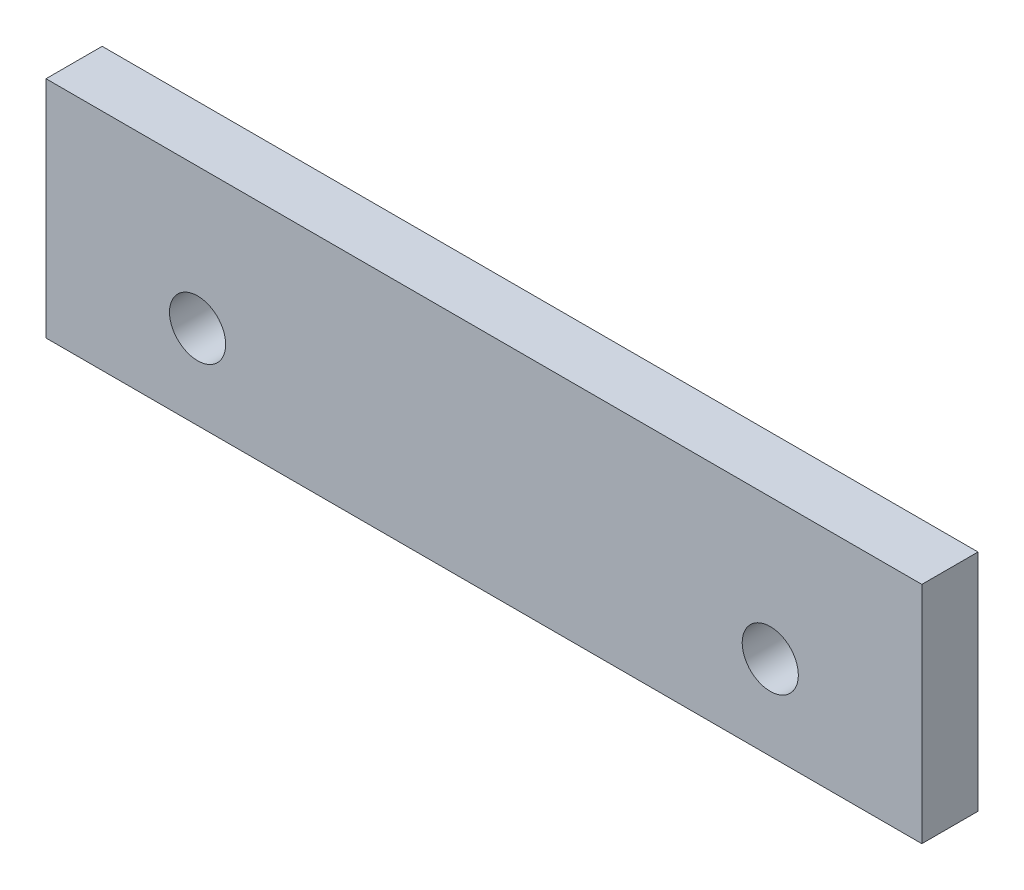
ISO-10303-21;
HEADER;
FILE_DESCRIPTION(('STEP AP214'),'2;1');
FILE_NAME('part.step','',(''),(''),'','','');
FILE_SCHEMA(('AUTOMOTIVE_DESIGN { 1 0 10303 214 1 1 1 1 }'));
ENDSEC;
DATA;
#1=APPLICATION_CONTEXT('core data for automotive mechanical design processes');
#2=APPLICATION_PROTOCOL_DEFINITION('international standard','automotive_design',2000,#1);
#3=PRODUCT_CONTEXT('',#1,'mechanical');
#4=PRODUCT('Part','Part','',(#3));
#5=PRODUCT_RELATED_PRODUCT_CATEGORY('part','',(#4));
#6=PRODUCT_DEFINITION_FORMATION('','',#4);
#7=PRODUCT_DEFINITION_CONTEXT('part definition',#1,'design');
#8=PRODUCT_DEFINITION('design','',#6,#7);
#9=PRODUCT_DEFINITION_SHAPE('','',#8);
#10=(LENGTH_UNIT() NAMED_UNIT(*) SI_UNIT(.MILLI.,.METRE.));
#11=(NAMED_UNIT(*) PLANE_ANGLE_UNIT() SI_UNIT($,.RADIAN.));
#12=(NAMED_UNIT(*) SI_UNIT($,.STERADIAN.) SOLID_ANGLE_UNIT());
#13=UNCERTAINTY_MEASURE_WITH_UNIT(LENGTH_MEASURE(1.E-05),#10,'distance_accuracy_value','');
#14=(GEOMETRIC_REPRESENTATION_CONTEXT(3) GLOBAL_UNCERTAINTY_ASSIGNED_CONTEXT((#13)) GLOBAL_UNIT_ASSIGNED_CONTEXT((#10,
#11,#12)) REPRESENTATION_CONTEXT('',''));
#15=CARTESIAN_POINT('',(0.,0.,0.));
#16=DIRECTION('',(0.,0.,1.));
#17=DIRECTION('',(1.,0.,0.));
#18=AXIS2_PLACEMENT_3D('',#15,#16,#17);
#19=CARTESIAN_POINT('',(-39.,10.,5.));
#20=DIRECTION('',(1.,0.,0.));
#21=DIRECTION('',(0.,0.,-1.));
#22=AXIS2_PLACEMENT_3D('',#19,#20,#21);
#23=PLANE('',#22);
#24=DIRECTION('',(0.,-1.,0.));
#25=VECTOR('',#24,1.);
#26=CARTESIAN_POINT('',(-39.,10.,0.));
#27=LINE('',#26,#25);
#28=CARTESIAN_POINT('',(-39.,10.,0.));
#29=VERTEX_POINT('',#28);
#30=CARTESIAN_POINT('',(-39.,-10.,0.));
#31=VERTEX_POINT('',#30);
#32=EDGE_CURVE('E96',#29,#31,#27,.T.);
#33=ORIENTED_EDGE('',*,*,#32,.T.);
#34=DIRECTION('',(0.,0.,-1.));
#35=VECTOR('',#34,1.);
#36=CARTESIAN_POINT('',(-39.,-10.,5.));
#37=LINE('',#36,#35);
#38=CARTESIAN_POINT('',(-39.,-10.,5.));
#39=VERTEX_POINT('',#38);
#40=EDGE_CURVE('E11',#39,#31,#37,.T.);
#41=ORIENTED_EDGE('',*,*,#40,.F.);
#42=DIRECTION('',(0.,-1.,0.));
#43=VECTOR('',#42,1.);
#44=CARTESIAN_POINT('',(-39.,10.,5.));
#45=LINE('',#44,#43);
#46=CARTESIAN_POINT('',(-39.,10.,5.));
#47=VERTEX_POINT('',#46);
#48=EDGE_CURVE('E84',#47,#39,#45,.T.);
#49=ORIENTED_EDGE('',*,*,#48,.F.);
#50=DIRECTION('',(0.,0.,-1.));
#51=VECTOR('',#50,1.);
#52=CARTESIAN_POINT('',(-39.,10.,5.));
#53=LINE('',#52,#51);
#54=EDGE_CURVE('E92',#47,#29,#53,.T.);
#55=ORIENTED_EDGE('',*,*,#54,.T.);
#56=EDGE_LOOP('',(#33,#41,#49,#55));
#57=FACE_BOUND('',#56,.T.);
#58=ADVANCED_FACE('F33',(#57),#23,.F.);
#59=CARTESIAN_POINT('',(-39.,-10.,5.));
#60=DIRECTION('',(0.,1.,0.));
#61=DIRECTION('',(0.,0.,1.));
#62=AXIS2_PLACEMENT_3D('',#59,#60,#61);
#63=PLANE('',#62);
#64=DIRECTION('',(1.,0.,0.));
#65=VECTOR('',#64,1.);
#66=CARTESIAN_POINT('',(-39.,-10.,0.));
#67=LINE('',#66,#65);
#68=CARTESIAN_POINT('',(39.,-10.,0.));
#69=VERTEX_POINT('',#68);
#70=EDGE_CURVE('E88',#31,#69,#67,.T.);
#71=ORIENTED_EDGE('',*,*,#70,.T.);
#72=DIRECTION('',(0.,0.,-1.));
#73=VECTOR('',#72,1.);
#74=CARTESIAN_POINT('',(39.,-10.,5.));
#75=LINE('',#74,#73);
#76=CARTESIAN_POINT('',(39.,-10.,5.));
#77=VERTEX_POINT('',#76);
#78=EDGE_CURVE('E41',#77,#69,#75,.T.);
#79=ORIENTED_EDGE('',*,*,#78,.F.);
#80=DIRECTION('',(1.,0.,0.));
#81=VECTOR('',#80,1.);
#82=CARTESIAN_POINT('',(-39.,-10.,5.));
#83=LINE('',#82,#81);
#84=EDGE_CURVE('E79',#39,#77,#83,.T.);
#85=ORIENTED_EDGE('',*,*,#84,.F.);
#86=ORIENTED_EDGE('',*,*,#40,.T.);
#87=EDGE_LOOP('',(#71,#79,#85,#86));
#88=FACE_BOUND('',#87,.T.);
#89=ADVANCED_FACE('F87',(#88),#63,.F.);
#90=CARTESIAN_POINT('',(39.,10.,5.));
#91=DIRECTION('',(-1.,0.,0.));
#92=DIRECTION('',(0.,0.,1.));
#93=AXIS2_PLACEMENT_3D('',#90,#91,#92);
#94=PLANE('',#93);
#95=DIRECTION('',(0.,1.,0.));
#96=VECTOR('',#95,1.);
#97=CARTESIAN_POINT('',(39.,10.,0.));
#98=LINE('',#97,#96);
#99=CARTESIAN_POINT('',(39.,10.,0.));
#100=VERTEX_POINT('',#99);
#101=EDGE_CURVE('E66',#69,#100,#98,.T.);
#102=ORIENTED_EDGE('',*,*,#101,.T.);
#103=DIRECTION('',(0.,0.,-1.));
#104=VECTOR('',#103,1.);
#105=CARTESIAN_POINT('',(39.,10.,5.));
#106=LINE('',#105,#104);
#107=CARTESIAN_POINT('',(39.,10.,5.));
#108=VERTEX_POINT('',#107);
#109=EDGE_CURVE('E89',#108,#100,#106,.T.);
#110=ORIENTED_EDGE('',*,*,#109,.F.);
#111=DIRECTION('',(0.,1.,0.));
#112=VECTOR('',#111,1.);
#113=CARTESIAN_POINT('',(39.,10.,5.));
#114=LINE('',#113,#112);
#115=EDGE_CURVE('E82',#77,#108,#114,.T.);
#116=ORIENTED_EDGE('',*,*,#115,.F.);
#117=ORIENTED_EDGE('',*,*,#78,.T.);
#118=EDGE_LOOP('',(#102,#110,#116,#117));
#119=FACE_BOUND('',#118,.T.);
#120=ADVANCED_FACE('F90',(#119),#94,.F.);
#121=CARTESIAN_POINT('',(-39.,10.,5.));
#122=DIRECTION('',(0.,-1.,0.));
#123=DIRECTION('',(0.,0.,-1.));
#124=AXIS2_PLACEMENT_3D('',#121,#122,#123);
#125=PLANE('',#124);
#126=DIRECTION('',(-1.,0.,0.));
#127=VECTOR('',#126,1.);
#128=CARTESIAN_POINT('',(-39.,10.,0.));
#129=LINE('',#128,#127);
#130=EDGE_CURVE('E72',#100,#29,#129,.T.);
#131=ORIENTED_EDGE('',*,*,#130,.T.);
#132=ORIENTED_EDGE('',*,*,#54,.F.);
#133=DIRECTION('',(-1.,0.,0.));
#134=VECTOR('',#133,1.);
#135=CARTESIAN_POINT('',(-39.,10.,5.));
#136=LINE('',#135,#134);
#137=EDGE_CURVE('E49',#108,#47,#136,.T.);
#138=ORIENTED_EDGE('',*,*,#137,.F.);
#139=ORIENTED_EDGE('',*,*,#109,.T.);
#140=EDGE_LOOP('',(#131,#132,#138,#139));
#141=FACE_BOUND('',#140,.T.);
#142=ADVANCED_FACE('F104',(#141),#125,.F.);
#143=CARTESIAN_POINT('',(0.,0.,5.));
#144=DIRECTION('',(0.,0.,1.));
#145=DIRECTION('',(1.,0.,0.));
#146=AXIS2_PLACEMENT_3D('',#143,#144,#145);
#147=PLANE('',#146);
#148=CARTESIAN_POINT('',(25.4999999996491,-2.5,5.));
#149=DIRECTION('',(0.,0.,1.));
#150=DIRECTION('',(1.,0.,0.));
#151=AXIS2_PLACEMENT_3D('',#148,#149,#150);
#152=CIRCLE('',#151,2.5);
#153=CARTESIAN_POINT('',(27.9999999996491,-2.5,5.));
#154=VERTEX_POINT('',#153);
#155=EDGE_CURVE('E99',#154,#154,#152,.T.);
#156=ORIENTED_EDGE('',*,*,#155,.F.);
#157=EDGE_LOOP('',(#156));
#158=FACE_BOUND('',#157,.T.);
#159=CARTESIAN_POINT('',(-25.5000000003509,-2.5,5.));
#160=DIRECTION('',(0.,0.,1.));
#161=DIRECTION('',(1.,0.,0.));
#162=AXIS2_PLACEMENT_3D('',#159,#160,#161);
#163=CIRCLE('',#162,2.5);
#164=CARTESIAN_POINT('',(-23.0000000003509,-2.5,5.));
#165=VERTEX_POINT('',#164);
#166=EDGE_CURVE('E112',#165,#165,#163,.T.);
#167=ORIENTED_EDGE('',*,*,#166,.F.);
#168=EDGE_LOOP('',(#167));
#169=FACE_BOUND('',#168,.T.);
#170=ORIENTED_EDGE('',*,*,#48,.T.);
#171=ORIENTED_EDGE('',*,*,#84,.T.);
#172=ORIENTED_EDGE('',*,*,#115,.T.);
#173=ORIENTED_EDGE('',*,*,#137,.T.);
#174=EDGE_LOOP('',(#170,#171,#172,#173));
#175=FACE_BOUND('',#174,.T.);
#176=ADVANCED_FACE('F80',(#158,#169,#175),#147,.T.);
#177=CARTESIAN_POINT('',(0.,0.,0.));
#178=DIRECTION('',(0.,0.,1.));
#179=DIRECTION('',(1.,0.,0.));
#180=AXIS2_PLACEMENT_3D('',#177,#178,#179);
#181=PLANE('',#180);
#182=CARTESIAN_POINT('',(25.4999999996491,-2.5,0.));
#183=DIRECTION('',(0.,0.,-1.));
#184=DIRECTION('',(-1.,0.,0.));
#185=AXIS2_PLACEMENT_3D('',#182,#183,#184);
#186=CIRCLE('',#185,2.5);
#187=CARTESIAN_POINT('',(22.9999999996491,-2.5,0.));
#188=VERTEX_POINT('',#187);
#189=EDGE_CURVE('E115',#188,#188,#186,.T.);
#190=ORIENTED_EDGE('',*,*,#189,.F.);
#191=EDGE_LOOP('',(#190));
#192=FACE_BOUND('',#191,.T.);
#193=CARTESIAN_POINT('',(-25.5000000003509,-2.5,0.));
#194=DIRECTION('',(0.,0.,-1.));
#195=DIRECTION('',(-1.,0.,0.));
#196=AXIS2_PLACEMENT_3D('',#193,#194,#195);
#197=CIRCLE('',#196,2.5);
#198=CARTESIAN_POINT('',(-28.0000000003509,-2.5,0.));
#199=VERTEX_POINT('',#198);
#200=EDGE_CURVE('E116',#199,#199,#197,.T.);
#201=ORIENTED_EDGE('',*,*,#200,.F.);
#202=EDGE_LOOP('',(#201));
#203=FACE_BOUND('',#202,.T.);
#204=ORIENTED_EDGE('',*,*,#32,.F.);
#205=ORIENTED_EDGE('',*,*,#130,.F.);
#206=ORIENTED_EDGE('',*,*,#101,.F.);
#207=ORIENTED_EDGE('',*,*,#70,.F.);
#208=EDGE_LOOP('',(#204,#205,#206,#207));
#209=FACE_BOUND('',#208,.T.);
#210=ADVANCED_FACE('F107',(#192,#203,#209),#181,.F.);
#211=CARTESIAN_POINT('',(-25.5000000003509,-2.5,10.));
#212=DIRECTION('',(0.,0.,-1.));
#213=DIRECTION('',(-1.,0.,0.));
#214=AXIS2_PLACEMENT_3D('',#211,#212,#213);
#215=CYLINDRICAL_SURFACE('',#214,2.5);
#216=ORIENTED_EDGE('',*,*,#166,.T.);
#217=EDGE_LOOP('',(#216));
#218=FACE_BOUND('',#217,.T.);
#219=ORIENTED_EDGE('',*,*,#200,.T.);
#220=EDGE_LOOP('',(#219));
#221=FACE_BOUND('',#220,.T.);
#222=ADVANCED_FACE('F126',(#218,#221),#215,.F.);
#223=CARTESIAN_POINT('',(25.4999999996491,-2.5,10.));
#224=DIRECTION('',(0.,0.,-1.));
#225=DIRECTION('',(-1.,0.,0.));
#226=AXIS2_PLACEMENT_3D('',#223,#224,#225);
#227=CYLINDRICAL_SURFACE('',#226,2.5);
#228=ORIENTED_EDGE('',*,*,#155,.T.);
#229=EDGE_LOOP('',(#228));
#230=FACE_BOUND('',#229,.T.);
#231=ORIENTED_EDGE('',*,*,#189,.T.);
#232=EDGE_LOOP('',(#231));
#233=FACE_BOUND('',#232,.T.);
#234=ADVANCED_FACE('F122',(#230,#233),#227,.F.);
#235=CLOSED_SHELL('',(#58,#89,#120,#142,#176,#210,#222,#234));
#236=MANIFOLD_SOLID_BREP('B2',#235);
#237=ADVANCED_BREP_SHAPE_REPRESENTATION('',(#18,#236),#14);
#238=SHAPE_DEFINITION_REPRESENTATION(#9,#237);
ENDSEC;
END-ISO-10303-21;
